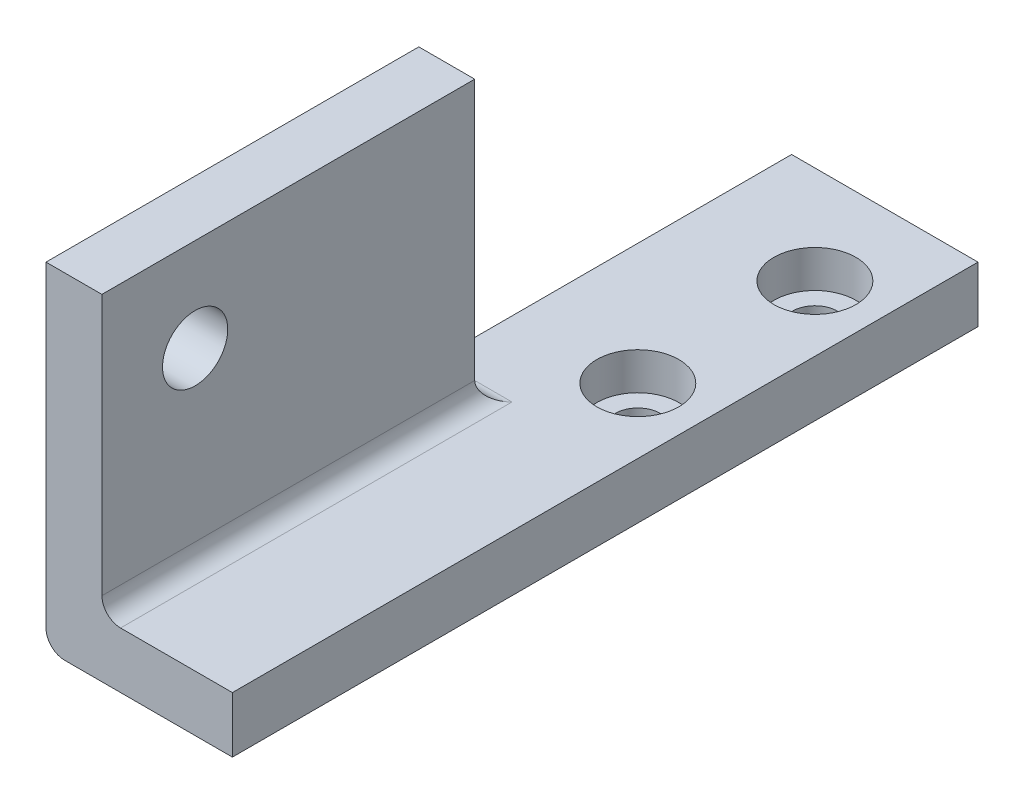
ISO-10303-21;
HEADER;
FILE_DESCRIPTION(('STEP AP214'),'2;1');
FILE_NAME('part.step','',(''),(''),'','','');
FILE_SCHEMA(('AUTOMOTIVE_DESIGN { 1 0 10303 214 1 1 1 1 }'));
ENDSEC;
DATA;
#1=APPLICATION_CONTEXT('core data for automotive mechanical design processes');
#2=APPLICATION_PROTOCOL_DEFINITION('international standard','automotive_design',2000,#1);
#3=PRODUCT_CONTEXT('',#1,'mechanical');
#4=PRODUCT('Part','Part','',(#3));
#5=PRODUCT_RELATED_PRODUCT_CATEGORY('part','',(#4));
#6=PRODUCT_DEFINITION_FORMATION('','',#4);
#7=PRODUCT_DEFINITION_CONTEXT('part definition',#1,'design');
#8=PRODUCT_DEFINITION('design','',#6,#7);
#9=PRODUCT_DEFINITION_SHAPE('','',#8);
#10=(LENGTH_UNIT() NAMED_UNIT(*) SI_UNIT(.MILLI.,.METRE.));
#11=(NAMED_UNIT(*) PLANE_ANGLE_UNIT() SI_UNIT($,.RADIAN.));
#12=(NAMED_UNIT(*) SI_UNIT($,.STERADIAN.) SOLID_ANGLE_UNIT());
#13=UNCERTAINTY_MEASURE_WITH_UNIT(LENGTH_MEASURE(1.E-05),#10,'distance_accuracy_value','');
#14=(GEOMETRIC_REPRESENTATION_CONTEXT(3) GLOBAL_UNCERTAINTY_ASSIGNED_CONTEXT((#13)) GLOBAL_UNIT_ASSIGNED_CONTEXT((#10,
#11,#12)) REPRESENTATION_CONTEXT('',''));
#15=CARTESIAN_POINT('',(0.,0.,0.));
#16=DIRECTION('',(0.,0.,1.));
#17=DIRECTION('',(1.,0.,0.));
#18=AXIS2_PLACEMENT_3D('',#15,#16,#17);
#19=CARTESIAN_POINT('',(0.,3.,0.));
#20=DIRECTION('',(0.,-1.,0.));
#21=DIRECTION('',(0.,0.,-1.));
#22=AXIS2_PLACEMENT_3D('',#19,#20,#21);
#23=PLANE('',#22);
#24=CARTESIAN_POINT('',(6.5,3.,-5.25));
#25=DIRECTION('',(0.,1.,0.));
#26=DIRECTION('',(0.,0.,1.));
#27=AXIS2_PLACEMENT_3D('',#24,#25,#26);
#28=CIRCLE('',#27,2.2);
#29=CARTESIAN_POINT('',(6.5,3.,-3.05));
#30=VERTEX_POINT('',#29);
#31=EDGE_CURVE('E170',#30,#30,#28,.T.);
#32=ORIENTED_EDGE('',*,*,#31,.F.);
#33=EDGE_LOOP('',(#32));
#34=FACE_BOUND('',#33,.T.);
#35=CARTESIAN_POINT('',(6.5,3.,-14.75));
#36=DIRECTION('',(0.,1.,0.));
#37=DIRECTION('',(0.,0.,1.));
#38=AXIS2_PLACEMENT_3D('',#35,#36,#37);
#39=CIRCLE('',#38,2.2);
#40=CARTESIAN_POINT('',(6.5,3.,-12.55));
#41=VERTEX_POINT('',#40);
#42=EDGE_CURVE('E158',#41,#41,#39,.T.);
#43=ORIENTED_EDGE('',*,*,#42,.F.);
#44=EDGE_LOOP('',(#43));
#45=FACE_BOUND('',#44,.T.);
#46=DIRECTION('',(0.,0.,1.));
#47=VECTOR('',#46,1.);
#48=CARTESIAN_POINT('',(0.,3.,0.));
#49=LINE('',#48,#47);
#50=CARTESIAN_POINT('',(0.,3.,-20.));
#51=VERTEX_POINT('',#50);
#52=CARTESIAN_POINT('',(0.,3.,-1.));
#53=VERTEX_POINT('',#52);
#54=EDGE_CURVE('E183',#51,#53,#49,.T.);
#55=ORIENTED_EDGE('',*,*,#54,.T.);
#56=DIRECTION('',(-1.,0.,0.));
#57=VECTOR('',#56,1.);
#58=CARTESIAN_POINT('',(3.,3.,-1.));
#59=LINE('',#58,#57);
#60=CARTESIAN_POINT('',(4.,3.,-1.));
#61=VERTEX_POINT('',#60);
#62=EDGE_CURVE('E203',#53,#61,#59,.F.);
#63=ORIENTED_EDGE('',*,*,#62,.T.);
#64=DIRECTION('',(0.,0.,-1.));
#65=VECTOR('',#64,1.);
#66=CARTESIAN_POINT('',(4.00000000000001,3.,20.));
#67=LINE('',#66,#65);
#68=CARTESIAN_POINT('',(4.00000000000001,3.,20.));
#69=VERTEX_POINT('',#68);
#70=EDGE_CURVE('E201',#61,#69,#67,.F.);
#71=ORIENTED_EDGE('',*,*,#70,.T.);
#72=DIRECTION('',(1.,0.,0.));
#73=VECTOR('',#72,1.);
#74=CARTESIAN_POINT('',(0.,3.,20.));
#75=LINE('',#74,#73);
#76=CARTESIAN_POINT('',(10.,3.,20.));
#77=VERTEX_POINT('',#76);
#78=EDGE_CURVE('E122',#69,#77,#75,.T.);
#79=ORIENTED_EDGE('',*,*,#78,.T.);
#80=DIRECTION('',(0.,0.,-1.));
#81=VECTOR('',#80,1.);
#82=CARTESIAN_POINT('',(10.,3.,0.));
#83=LINE('',#82,#81);
#84=CARTESIAN_POINT('',(10.,3.,-20.));
#85=VERTEX_POINT('',#84);
#86=EDGE_CURVE('E186',#77,#85,#83,.T.);
#87=ORIENTED_EDGE('',*,*,#86,.T.);
#88=DIRECTION('',(-1.,0.,0.));
#89=VECTOR('',#88,1.);
#90=CARTESIAN_POINT('',(0.,3.,-20.));
#91=LINE('',#90,#89);
#92=EDGE_CURVE('E189',#85,#51,#91,.T.);
#93=ORIENTED_EDGE('',*,*,#92,.T.);
#94=EDGE_LOOP('',(#55,#63,#71,#79,#87,#93));
#95=FACE_BOUND('',#94,.T.);
#96=ADVANCED_FACE('F39',(#34,#45,#95),#23,.F.);
#97=CARTESIAN_POINT('',(0.,0.,0.));
#98=DIRECTION('',(0.,-1.,0.));
#99=DIRECTION('',(0.,0.,-1.));
#100=AXIS2_PLACEMENT_3D('',#97,#98,#99);
#101=PLANE('',#100);
#102=CARTESIAN_POINT('',(6.5,0.,-14.75));
#103=DIRECTION('',(0.,1.,0.));
#104=DIRECTION('',(0.,0.,1.));
#105=AXIS2_PLACEMENT_3D('',#102,#103,#104);
#106=CIRCLE('',#105,1.2);
#107=CARTESIAN_POINT('',(6.5,0.,-13.55));
#108=VERTEX_POINT('',#107);
#109=EDGE_CURVE('E167',#108,#108,#106,.T.);
#110=ORIENTED_EDGE('',*,*,#109,.T.);
#111=EDGE_LOOP('',(#110));
#112=FACE_BOUND('',#111,.T.);
#113=CARTESIAN_POINT('',(6.5,0.,-5.25));
#114=DIRECTION('',(0.,1.,0.));
#115=DIRECTION('',(0.,0.,1.));
#116=AXIS2_PLACEMENT_3D('',#113,#114,#115);
#117=CIRCLE('',#116,1.2);
#118=CARTESIAN_POINT('',(6.5,0.,-4.05));
#119=VERTEX_POINT('',#118);
#120=EDGE_CURVE('E179',#119,#119,#117,.T.);
#121=ORIENTED_EDGE('',*,*,#120,.T.);
#122=EDGE_LOOP('',(#121));
#123=FACE_BOUND('',#122,.T.);
#124=DIRECTION('',(-1.,0.,0.));
#125=VECTOR('',#124,1.);
#126=CARTESIAN_POINT('',(0.,0.,20.));
#127=LINE('',#126,#125);
#128=CARTESIAN_POINT('',(10.,0.,20.));
#129=VERTEX_POINT('',#128);
#130=CARTESIAN_POINT('',(1.,0.,20.));
#131=VERTEX_POINT('',#130);
#132=EDGE_CURVE('E156',#129,#131,#127,.T.);
#133=ORIENTED_EDGE('',*,*,#132,.T.);
#134=DIRECTION('',(0.,0.,1.));
#135=VECTOR('',#134,1.);
#136=CARTESIAN_POINT('',(1.,0.,-20.));
#137=LINE('',#136,#135);
#138=CARTESIAN_POINT('',(1.,0.,-20.));
#139=VERTEX_POINT('',#138);
#140=EDGE_CURVE('E47',#131,#139,#137,.F.);
#141=ORIENTED_EDGE('',*,*,#140,.T.);
#142=DIRECTION('',(-1.,0.,0.));
#143=VECTOR('',#142,1.);
#144=CARTESIAN_POINT('',(0.,0.,-20.));
#145=LINE('',#144,#143);
#146=CARTESIAN_POINT('',(10.,0.,-20.));
#147=VERTEX_POINT('',#146);
#148=EDGE_CURVE('E187',#147,#139,#145,.T.);
#149=ORIENTED_EDGE('',*,*,#148,.F.);
#150=DIRECTION('',(0.,0.,-1.));
#151=VECTOR('',#150,1.);
#152=CARTESIAN_POINT('',(10.,0.,0.));
#153=LINE('',#152,#151);
#154=EDGE_CURVE('E182',#129,#147,#153,.T.);
#155=ORIENTED_EDGE('',*,*,#154,.F.);
#156=EDGE_LOOP('',(#133,#141,#149,#155));
#157=FACE_BOUND('',#156,.T.);
#158=ADVANCED_FACE('F254',(#112,#123,#157),#101,.T.);
#159=CARTESIAN_POINT('',(0.,3.,0.));
#160=DIRECTION('',(1.,0.,0.));
#161=DIRECTION('',(0.,0.,-1.));
#162=AXIS2_PLACEMENT_3D('',#159,#160,#161);
#163=PLANE('',#162);
#164=CARTESIAN_POINT('',(0.,13.,15.));
#165=DIRECTION('',(1.,0.,0.));
#166=DIRECTION('',(0.,0.,-1.));
#167=AXIS2_PLACEMENT_3D('',#164,#165,#166);
#168=CIRCLE('',#167,1.75);
#169=CARTESIAN_POINT('',(0.,13.,13.25));
#170=VERTEX_POINT('',#169);
#171=EDGE_CURVE('E137',#170,#170,#168,.T.);
#172=ORIENTED_EDGE('',*,*,#171,.T.);
#173=EDGE_LOOP('',(#172));
#174=FACE_BOUND('',#173,.T.);
#175=DIRECTION('',(0.,-1.,0.));
#176=VECTOR('',#175,1.);
#177=CARTESIAN_POINT('',(0.,3.,-20.));
#178=LINE('',#177,#176);
#179=CARTESIAN_POINT('',(0.,1.,-20.));
#180=VERTEX_POINT('',#179);
#181=EDGE_CURVE('E191',#51,#180,#178,.T.);
#182=ORIENTED_EDGE('',*,*,#181,.T.);
#183=DIRECTION('',(0.,0.,1.));
#184=VECTOR('',#183,1.);
#185=CARTESIAN_POINT('',(0.,1.,20.));
#186=LINE('',#185,#184);
#187=CARTESIAN_POINT('',(0.,1.,20.));
#188=VERTEX_POINT('',#187);
#189=EDGE_CURVE('E121',#180,#188,#186,.T.);
#190=ORIENTED_EDGE('',*,*,#189,.T.);
#191=DIRECTION('',(0.,1.,0.));
#192=VECTOR('',#191,1.);
#193=CARTESIAN_POINT('',(0.,0.,20.));
#194=LINE('',#193,#192);
#195=CARTESIAN_POINT('',(0.,18.,20.));
#196=VERTEX_POINT('',#195);
#197=EDGE_CURVE('E113',#188,#196,#194,.T.);
#198=ORIENTED_EDGE('',*,*,#197,.T.);
#199=DIRECTION('',(0.,0.,1.));
#200=VECTOR('',#199,1.);
#201=CARTESIAN_POINT('',(0.,18.,20.));
#202=LINE('',#201,#200);
#203=CARTESIAN_POINT('',(0.,18.,0.));
#204=VERTEX_POINT('',#203);
#205=EDGE_CURVE('E119',#204,#196,#202,.T.);
#206=ORIENTED_EDGE('',*,*,#205,.F.);
#207=DIRECTION('',(0.,-1.,0.));
#208=VECTOR('',#207,1.);
#209=CARTESIAN_POINT('',(0.,18.,0.));
#210=LINE('',#209,#208);
#211=CARTESIAN_POINT('',(0.,4.,0.));
#212=VERTEX_POINT('',#211);
#213=EDGE_CURVE('E146',#204,#212,#210,.T.);
#214=ORIENTED_EDGE('',*,*,#213,.T.);
#215=CARTESIAN_POINT('',(0.,4.,-1.));
#216=DIRECTION('',(1.,0.,0.));
#217=DIRECTION('',(0.,0.,-1.));
#218=AXIS2_PLACEMENT_3D('',#215,#216,#217);
#219=CIRCLE('',#218,1.);
#220=EDGE_CURVE('E207',#212,#53,#219,.T.);
#221=ORIENTED_EDGE('',*,*,#220,.T.);
#222=ORIENTED_EDGE('',*,*,#54,.F.);
#223=EDGE_LOOP('',(#182,#190,#198,#206,#214,#221,#222));
#224=FACE_BOUND('',#223,.T.);
#225=ADVANCED_FACE('F116',(#174,#224),#163,.F.);
#226=CARTESIAN_POINT('',(10.,3.,0.));
#227=DIRECTION('',(-1.,0.,0.));
#228=DIRECTION('',(0.,0.,1.));
#229=AXIS2_PLACEMENT_3D('',#226,#227,#228);
#230=PLANE('',#229);
#231=ORIENTED_EDGE('',*,*,#154,.T.);
#232=DIRECTION('',(0.,-1.,0.));
#233=VECTOR('',#232,1.);
#234=CARTESIAN_POINT('',(10.,3.,-20.));
#235=LINE('',#234,#233);
#236=EDGE_CURVE('E195',#85,#147,#235,.T.);
#237=ORIENTED_EDGE('',*,*,#236,.F.);
#238=ORIENTED_EDGE('',*,*,#86,.F.);
#239=DIRECTION('',(0.,-1.,0.));
#240=VECTOR('',#239,1.);
#241=CARTESIAN_POINT('',(10.,0.,20.));
#242=LINE('',#241,#240);
#243=EDGE_CURVE('E153',#77,#129,#242,.T.);
#244=ORIENTED_EDGE('',*,*,#243,.T.);
#245=EDGE_LOOP('',(#231,#237,#238,#244));
#246=FACE_BOUND('',#245,.T.);
#247=ADVANCED_FACE('F271',(#246),#230,.F.);
#248=CARTESIAN_POINT('',(0.,3.,-20.));
#249=DIRECTION('',(0.,0.,1.));
#250=DIRECTION('',(1.,0.,0.));
#251=AXIS2_PLACEMENT_3D('',#248,#249,#250);
#252=PLANE('',#251);
#253=ORIENTED_EDGE('',*,*,#148,.T.);
#254=CARTESIAN_POINT('',(1.,1.,-20.));
#255=DIRECTION('',(0.,0.,1.));
#256=DIRECTION('',(1.,0.,0.));
#257=AXIS2_PLACEMENT_3D('',#254,#255,#256);
#258=CIRCLE('',#257,1.);
#259=EDGE_CURVE('E11',#139,#180,#258,.F.);
#260=ORIENTED_EDGE('',*,*,#259,.T.);
#261=ORIENTED_EDGE('',*,*,#181,.F.);
#262=ORIENTED_EDGE('',*,*,#92,.F.);
#263=ORIENTED_EDGE('',*,*,#236,.T.);
#264=EDGE_LOOP('',(#253,#260,#261,#262,#263));
#265=FACE_BOUND('',#264,.T.);
#266=ADVANCED_FACE('F244',(#265),#252,.F.);
#267=CARTESIAN_POINT('',(6.5,3.,-5.25));
#268=DIRECTION('',(0.,1.,0.));
#269=DIRECTION('',(0.,0.,1.));
#270=AXIS2_PLACEMENT_3D('',#267,#268,#269);
#271=CYLINDRICAL_SURFACE('',#270,1.2);
#272=ORIENTED_EDGE('',*,*,#120,.F.);
#273=EDGE_LOOP('',(#272));
#274=FACE_BOUND('',#273,.T.);
#275=CARTESIAN_POINT('',(6.5,1.,-5.25));
#276=DIRECTION('',(0.,1.,0.));
#277=DIRECTION('',(0.,0.,1.));
#278=AXIS2_PLACEMENT_3D('',#275,#276,#277);
#279=CIRCLE('',#278,1.2);
#280=CARTESIAN_POINT('',(6.5,1.,-4.05));
#281=VERTEX_POINT('',#280);
#282=EDGE_CURVE('E176',#281,#281,#279,.T.);
#283=ORIENTED_EDGE('',*,*,#282,.T.);
#284=EDGE_LOOP('',(#283));
#285=FACE_BOUND('',#284,.T.);
#286=ADVANCED_FACE('F266',(#274,#285),#271,.F.);
#287=CARTESIAN_POINT('',(7.7,1.,-5.25));
#288=DIRECTION('',(0.,-1.,0.));
#289=DIRECTION('',(0.,0.,-1.));
#290=AXIS2_PLACEMENT_3D('',#287,#288,#289);
#291=PLANE('',#290);
#292=ORIENTED_EDGE('',*,*,#282,.F.);
#293=EDGE_LOOP('',(#292));
#294=FACE_BOUND('',#293,.T.);
#295=CARTESIAN_POINT('',(6.5,1.,-5.25));
#296=DIRECTION('',(0.,1.,0.));
#297=DIRECTION('',(0.,0.,1.));
#298=AXIS2_PLACEMENT_3D('',#295,#296,#297);
#299=CIRCLE('',#298,2.2);
#300=CARTESIAN_POINT('',(6.5,1.,-3.05));
#301=VERTEX_POINT('',#300);
#302=EDGE_CURVE('E173',#301,#301,#299,.T.);
#303=ORIENTED_EDGE('',*,*,#302,.T.);
#304=EDGE_LOOP('',(#303));
#305=FACE_BOUND('',#304,.T.);
#306=ADVANCED_FACE('F305',(#294,#305),#291,.F.);
#307=CARTESIAN_POINT('',(6.5,3.,-5.25));
#308=DIRECTION('',(0.,1.,0.));
#309=DIRECTION('',(0.,0.,1.));
#310=AXIS2_PLACEMENT_3D('',#307,#308,#309);
#311=CYLINDRICAL_SURFACE('',#310,2.2);
#312=ORIENTED_EDGE('',*,*,#302,.F.);
#313=EDGE_LOOP('',(#312));
#314=FACE_BOUND('',#313,.T.);
#315=ORIENTED_EDGE('',*,*,#31,.T.);
#316=EDGE_LOOP('',(#315));
#317=FACE_BOUND('',#316,.T.);
#318=ADVANCED_FACE('F302',(#314,#317),#311,.F.);
#319=CARTESIAN_POINT('',(6.5,3.,-14.75));
#320=DIRECTION('',(0.,1.,0.));
#321=DIRECTION('',(0.,0.,1.));
#322=AXIS2_PLACEMENT_3D('',#319,#320,#321);
#323=CYLINDRICAL_SURFACE('',#322,1.2);
#324=ORIENTED_EDGE('',*,*,#109,.F.);
#325=EDGE_LOOP('',(#324));
#326=FACE_BOUND('',#325,.T.);
#327=CARTESIAN_POINT('',(6.5,1.,-14.75));
#328=DIRECTION('',(0.,1.,0.));
#329=DIRECTION('',(0.,0.,1.));
#330=AXIS2_PLACEMENT_3D('',#327,#328,#329);
#331=CIRCLE('',#330,1.2);
#332=CARTESIAN_POINT('',(6.5,1.,-13.55));
#333=VERTEX_POINT('',#332);
#334=EDGE_CURVE('E164',#333,#333,#331,.T.);
#335=ORIENTED_EDGE('',*,*,#334,.T.);
#336=EDGE_LOOP('',(#335));
#337=FACE_BOUND('',#336,.T.);
#338=ADVANCED_FACE('F298',(#326,#337),#323,.F.);
#339=CARTESIAN_POINT('',(7.7,1.,-14.75));
#340=DIRECTION('',(0.,-1.,0.));
#341=DIRECTION('',(0.,0.,-1.));
#342=AXIS2_PLACEMENT_3D('',#339,#340,#341);
#343=PLANE('',#342);
#344=ORIENTED_EDGE('',*,*,#334,.F.);
#345=EDGE_LOOP('',(#344));
#346=FACE_BOUND('',#345,.T.);
#347=CARTESIAN_POINT('',(6.5,1.,-14.75));
#348=DIRECTION('',(0.,1.,0.));
#349=DIRECTION('',(0.,0.,1.));
#350=AXIS2_PLACEMENT_3D('',#347,#348,#349);
#351=CIRCLE('',#350,2.2);
#352=CARTESIAN_POINT('',(6.5,1.,-12.55));
#353=VERTEX_POINT('',#352);
#354=EDGE_CURVE('E161',#353,#353,#351,.T.);
#355=ORIENTED_EDGE('',*,*,#354,.T.);
#356=EDGE_LOOP('',(#355));
#357=FACE_BOUND('',#356,.T.);
#358=ADVANCED_FACE('F294',(#346,#357),#343,.F.);
#359=CARTESIAN_POINT('',(6.5,3.,-14.75));
#360=DIRECTION('',(0.,1.,0.));
#361=DIRECTION('',(0.,0.,1.));
#362=AXIS2_PLACEMENT_3D('',#359,#360,#361);
#363=CYLINDRICAL_SURFACE('',#362,2.2);
#364=ORIENTED_EDGE('',*,*,#354,.F.);
#365=EDGE_LOOP('',(#364));
#366=FACE_BOUND('',#365,.T.);
#367=ORIENTED_EDGE('',*,*,#42,.T.);
#368=EDGE_LOOP('',(#367));
#369=FACE_BOUND('',#368,.T.);
#370=ADVANCED_FACE('F291',(#366,#369),#363,.F.);
#371=CARTESIAN_POINT('',(0.,0.,20.));
#372=DIRECTION('',(0.,0.,-1.));
#373=DIRECTION('',(-1.,0.,0.));
#374=AXIS2_PLACEMENT_3D('',#371,#372,#373);
#375=PLANE('',#374);
#376=ORIENTED_EDGE('',*,*,#197,.F.);
#377=CARTESIAN_POINT('',(1.,1.,20.));
#378=DIRECTION('',(0.,0.,-1.));
#379=DIRECTION('',(-1.,0.,0.));
#380=AXIS2_PLACEMENT_3D('',#377,#378,#379);
#381=CIRCLE('',#380,1.);
#382=EDGE_CURVE('E61',#188,#131,#381,.F.);
#383=ORIENTED_EDGE('',*,*,#382,.T.);
#384=ORIENTED_EDGE('',*,*,#132,.F.);
#385=ORIENTED_EDGE('',*,*,#243,.F.);
#386=ORIENTED_EDGE('',*,*,#78,.F.);
#387=CARTESIAN_POINT('',(4.00000000000001,4.,20.));
#388=DIRECTION('',(0.,0.,-1.));
#389=DIRECTION('',(-1.,0.,0.));
#390=AXIS2_PLACEMENT_3D('',#387,#388,#389);
#391=CIRCLE('',#390,1.);
#392=CARTESIAN_POINT('',(3.00000000000001,4.,20.));
#393=VERTEX_POINT('',#392);
#394=EDGE_CURVE('E209',#69,#393,#391,.T.);
#395=ORIENTED_EDGE('',*,*,#394,.T.);
#396=DIRECTION('',(0.,-1.,0.));
#397=VECTOR('',#396,1.);
#398=CARTESIAN_POINT('',(3.00000000000001,18.,20.));
#399=LINE('',#398,#397);
#400=CARTESIAN_POINT('',(3.00000000000001,18.,20.));
#401=VERTEX_POINT('',#400);
#402=EDGE_CURVE('E123',#401,#393,#399,.T.);
#403=ORIENTED_EDGE('',*,*,#402,.F.);
#404=DIRECTION('',(1.,0.,0.));
#405=VECTOR('',#404,1.);
#406=CARTESIAN_POINT('',(0.,18.,20.));
#407=LINE('',#406,#405);
#408=EDGE_CURVE('E126',#196,#401,#407,.T.);
#409=ORIENTED_EDGE('',*,*,#408,.F.);
#410=EDGE_LOOP('',(#376,#383,#384,#385,#386,#395,#403,#409));
#411=FACE_BOUND('',#410,.T.);
#412=ADVANCED_FACE('F127',(#411),#375,.F.);
#413=CARTESIAN_POINT('',(3.00000000000001,18.,20.));
#414=DIRECTION('',(-1.,0.,0.));
#415=DIRECTION('',(0.,0.,1.));
#416=AXIS2_PLACEMENT_3D('',#413,#414,#415);
#417=PLANE('',#416);
#418=CARTESIAN_POINT('',(3.,13.,15.));
#419=DIRECTION('',(1.,0.,0.));
#420=DIRECTION('',(0.,0.,-1.));
#421=AXIS2_PLACEMENT_3D('',#418,#419,#420);
#422=CIRCLE('',#421,1.75);
#423=CARTESIAN_POINT('',(3.,13.,13.25));
#424=VERTEX_POINT('',#423);
#425=EDGE_CURVE('E140',#424,#424,#422,.T.);
#426=ORIENTED_EDGE('',*,*,#425,.F.);
#427=EDGE_LOOP('',(#426));
#428=FACE_BOUND('',#427,.T.);
#429=ORIENTED_EDGE('',*,*,#402,.T.);
#430=DIRECTION('',(0.,0.,-1.));
#431=VECTOR('',#430,1.);
#432=CARTESIAN_POINT('',(3.,4.,0.));
#433=LINE('',#432,#431);
#434=CARTESIAN_POINT('',(3.,4.,0.));
#435=VERTEX_POINT('',#434);
#436=EDGE_CURVE('E205',#393,#435,#433,.T.);
#437=ORIENTED_EDGE('',*,*,#436,.T.);
#438=DIRECTION('',(0.,-1.,0.));
#439=VECTOR('',#438,1.);
#440=CARTESIAN_POINT('',(3.,18.,0.));
#441=LINE('',#440,#439);
#442=CARTESIAN_POINT('',(3.,18.,0.));
#443=VERTEX_POINT('',#442);
#444=EDGE_CURVE('E148',#443,#435,#441,.T.);
#445=ORIENTED_EDGE('',*,*,#444,.F.);
#446=DIRECTION('',(0.,0.,-1.));
#447=VECTOR('',#446,1.);
#448=CARTESIAN_POINT('',(3.00000000000001,18.,20.));
#449=LINE('',#448,#447);
#450=EDGE_CURVE('E131',#401,#443,#449,.T.);
#451=ORIENTED_EDGE('',*,*,#450,.F.);
#452=EDGE_LOOP('',(#429,#437,#445,#451));
#453=FACE_BOUND('',#452,.T.);
#454=ADVANCED_FACE('F224',(#428,#453),#417,.F.);
#455=CARTESIAN_POINT('',(0.,18.,0.));
#456=DIRECTION('',(0.,0.,1.));
#457=DIRECTION('',(1.,0.,0.));
#458=AXIS2_PLACEMENT_3D('',#455,#456,#457);
#459=PLANE('',#458);
#460=ORIENTED_EDGE('',*,*,#444,.T.);
#461=DIRECTION('',(-1.,0.,0.));
#462=VECTOR('',#461,1.);
#463=CARTESIAN_POINT('',(0.,4.,0.));
#464=LINE('',#463,#462);
#465=EDGE_CURVE('E198',#435,#212,#464,.T.);
#466=ORIENTED_EDGE('',*,*,#465,.T.);
#467=ORIENTED_EDGE('',*,*,#213,.F.);
#468=DIRECTION('',(-1.,0.,0.));
#469=VECTOR('',#468,1.);
#470=CARTESIAN_POINT('',(0.,18.,0.));
#471=LINE('',#470,#469);
#472=EDGE_CURVE('E135',#443,#204,#471,.T.);
#473=ORIENTED_EDGE('',*,*,#472,.F.);
#474=EDGE_LOOP('',(#460,#466,#467,#473));
#475=FACE_BOUND('',#474,.T.);
#476=ADVANCED_FACE('F227',(#475),#459,.F.);
#477=CARTESIAN_POINT('',(0.,18.,0.));
#478=DIRECTION('',(0.,-1.,0.));
#479=DIRECTION('',(0.,0.,-1.));
#480=AXIS2_PLACEMENT_3D('',#477,#478,#479);
#481=PLANE('',#480);
#482=ORIENTED_EDGE('',*,*,#205,.T.);
#483=ORIENTED_EDGE('',*,*,#408,.T.);
#484=ORIENTED_EDGE('',*,*,#450,.T.);
#485=ORIENTED_EDGE('',*,*,#472,.T.);
#486=EDGE_LOOP('',(#482,#483,#484,#485));
#487=FACE_BOUND('',#486,.T.);
#488=ADVANCED_FACE('F133',(#487),#481,.F.);
#489=CARTESIAN_POINT('',(0.,13.,15.));
#490=DIRECTION('',(1.,0.,0.));
#491=DIRECTION('',(0.,0.,-1.));
#492=AXIS2_PLACEMENT_3D('',#489,#490,#491);
#493=CYLINDRICAL_SURFACE('',#492,1.75);
#494=ORIENTED_EDGE('',*,*,#171,.F.);
#495=EDGE_LOOP('',(#494));
#496=FACE_BOUND('',#495,.T.);
#497=ORIENTED_EDGE('',*,*,#425,.T.);
#498=EDGE_LOOP('',(#497));
#499=FACE_BOUND('',#498,.T.);
#500=ADVANCED_FACE('F222',(#496,#499),#493,.F.);
#501=CARTESIAN_POINT('',(4.00000000000001,4.,20.));
#502=DIRECTION('',(0.,0.,1.));
#503=DIRECTION('',(1.,0.,0.));
#504=AXIS2_PLACEMENT_3D('',#501,#502,#503);
#505=CYLINDRICAL_SURFACE('',#504,1.);
#506=ORIENTED_EDGE('',*,*,#394,.F.);
#507=ORIENTED_EDGE('',*,*,#70,.F.);
#508=CARTESIAN_POINT('',(4.,4.,-1.));
#509=DIRECTION('',(0.707106781186548,0.,0.707106781186547));
#510=DIRECTION('',(-0.707106781186547,0.,0.707106781186548));
#511=AXIS2_PLACEMENT_3D('',#508,#509,#510);
#512=ELLIPSE('',#511,1.41421356237309,1.);
#513=EDGE_CURVE('E211',#435,#61,#512,.T.);
#514=ORIENTED_EDGE('',*,*,#513,.F.);
#515=ORIENTED_EDGE('',*,*,#436,.F.);
#516=EDGE_LOOP('',(#506,#507,#514,#515));
#517=FACE_BOUND('',#516,.T.);
#518=ADVANCED_FACE('F233',(#517),#505,.F.);
#519=CARTESIAN_POINT('',(0.,4.,-1.));
#520=DIRECTION('',(1.,0.,0.));
#521=DIRECTION('',(0.,0.,-1.));
#522=AXIS2_PLACEMENT_3D('',#519,#520,#521);
#523=CYLINDRICAL_SURFACE('',#522,1.);
#524=ORIENTED_EDGE('',*,*,#513,.T.);
#525=ORIENTED_EDGE('',*,*,#62,.F.);
#526=ORIENTED_EDGE('',*,*,#220,.F.);
#527=ORIENTED_EDGE('',*,*,#465,.F.);
#528=EDGE_LOOP('',(#524,#525,#526,#527));
#529=FACE_BOUND('',#528,.T.);
#530=ADVANCED_FACE('F235',(#529),#523,.F.);
#531=CARTESIAN_POINT('',(1.,1.,0.));
#532=DIRECTION('',(0.,0.,-1.));
#533=DIRECTION('',(-1.,0.,0.));
#534=AXIS2_PLACEMENT_3D('',#531,#532,#533);
#535=CYLINDRICAL_SURFACE('',#534,1.);
#536=ORIENTED_EDGE('',*,*,#259,.F.);
#537=ORIENTED_EDGE('',*,*,#140,.F.);
#538=ORIENTED_EDGE('',*,*,#382,.F.);
#539=ORIENTED_EDGE('',*,*,#189,.F.);
#540=EDGE_LOOP('',(#536,#537,#538,#539));
#541=FACE_BOUND('',#540,.T.);
#542=ADVANCED_FACE('F41',(#541),#535,.T.);
#543=CLOSED_SHELL('',(#96,#158,#225,#247,#266,#286,#306,#318,#338,#358,#370,#412,#454,#476,#488,
#500,#518,#530,#542));
#544=MANIFOLD_SOLID_BREP('B2',#543);
#545=ADVANCED_BREP_SHAPE_REPRESENTATION('',(#18,#544),#14);
#546=SHAPE_DEFINITION_REPRESENTATION(#9,#545);
ENDSEC;
END-ISO-10303-21;
